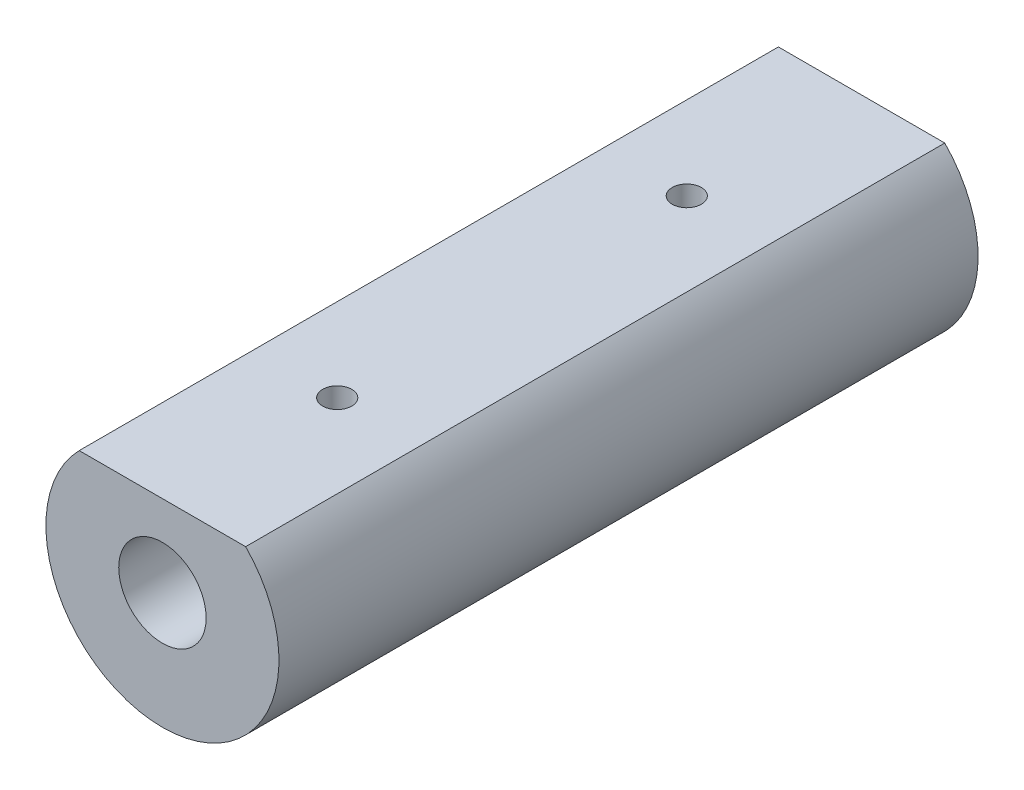
ISO-10303-21;
HEADER;
FILE_DESCRIPTION(('STEP AP214'),'2;1');
FILE_NAME('part.step','',(''),(''),'','','');
FILE_SCHEMA(('AUTOMOTIVE_DESIGN { 1 0 10303 214 1 1 1 1 }'));
ENDSEC;
DATA;
#1=APPLICATION_CONTEXT('core data for automotive mechanical design processes');
#2=APPLICATION_PROTOCOL_DEFINITION('international standard','automotive_design',2000,#1);
#3=PRODUCT_CONTEXT('',#1,'mechanical');
#4=PRODUCT('Part','Part','',(#3));
#5=PRODUCT_RELATED_PRODUCT_CATEGORY('part','',(#4));
#6=PRODUCT_DEFINITION_FORMATION('','',#4);
#7=PRODUCT_DEFINITION_CONTEXT('part definition',#1,'design');
#8=PRODUCT_DEFINITION('design','',#6,#7);
#9=PRODUCT_DEFINITION_SHAPE('','',#8);
#10=(LENGTH_UNIT() NAMED_UNIT(*) SI_UNIT(.MILLI.,.METRE.));
#11=(NAMED_UNIT(*) PLANE_ANGLE_UNIT() SI_UNIT($,.RADIAN.));
#12=(NAMED_UNIT(*) SI_UNIT($,.STERADIAN.) SOLID_ANGLE_UNIT());
#13=UNCERTAINTY_MEASURE_WITH_UNIT(LENGTH_MEASURE(1.E-05),#10,'distance_accuracy_value','');
#14=(GEOMETRIC_REPRESENTATION_CONTEXT(3) GLOBAL_UNCERTAINTY_ASSIGNED_CONTEXT((#13)) GLOBAL_UNIT_ASSIGNED_CONTEXT((#10,
#11,#12)) REPRESENTATION_CONTEXT('',''));
#15=CARTESIAN_POINT('',(0.,0.,0.));
#16=DIRECTION('',(0.,0.,1.));
#17=DIRECTION('',(1.,0.,0.));
#18=AXIS2_PLACEMENT_3D('',#15,#16,#17);
#19=CARTESIAN_POINT('',(0.,0.,60.));
#20=DIRECTION('',(0.,0.,-1.));
#21=DIRECTION('',(-1.,0.,0.));
#22=AXIS2_PLACEMENT_3D('',#19,#20,#21);
#23=CYLINDRICAL_SURFACE('',#22,10.);
#24=CARTESIAN_POINT('',(0.,0.,60.));
#25=DIRECTION('',(0.,0.,1.));
#26=DIRECTION('',(1.,0.,0.));
#27=AXIS2_PLACEMENT_3D('',#24,#25,#26);
#28=CIRCLE('',#27,10.);
#29=CARTESIAN_POINT('',(-7.14142842854285,7.,60.));
#30=VERTEX_POINT('',#29);
#31=CARTESIAN_POINT('',(7.14142842854285,7.,60.));
#32=VERTEX_POINT('',#31);
#33=EDGE_CURVE('E11',#30,#32,#28,.T.);
#34=ORIENTED_EDGE('',*,*,#33,.F.);
#35=DIRECTION('',(0.,0.,-1.));
#36=VECTOR('',#35,1.);
#37=CARTESIAN_POINT('',(-7.14142842854285,7.,60.001));
#38=LINE('',#37,#36);
#39=CARTESIAN_POINT('',(-7.14142842854285,7.,0.));
#40=VERTEX_POINT('',#39);
#41=EDGE_CURVE('E52',#30,#40,#38,.T.);
#42=ORIENTED_EDGE('',*,*,#41,.T.);
#43=CARTESIAN_POINT('',(0.,0.,0.));
#44=DIRECTION('',(0.,0.,1.));
#45=DIRECTION('',(1.,0.,0.));
#46=AXIS2_PLACEMENT_3D('',#43,#44,#45);
#47=CIRCLE('',#46,10.);
#48=CARTESIAN_POINT('',(7.14142842854285,7.,0.));
#49=VERTEX_POINT('',#48);
#50=EDGE_CURVE('E36',#40,#49,#47,.T.);
#51=ORIENTED_EDGE('',*,*,#50,.T.);
#52=DIRECTION('',(0.,0.,-1.));
#53=VECTOR('',#52,1.);
#54=CARTESIAN_POINT('',(7.14142842854285,7.,60.001));
#55=LINE('',#54,#53);
#56=EDGE_CURVE('E47',#32,#49,#55,.T.);
#57=ORIENTED_EDGE('',*,*,#56,.F.);
#58=EDGE_LOOP('',(#34,#42,#51,#57));
#59=FACE_BOUND('',#58,.T.);
#60=ADVANCED_FACE('F33',(#59),#23,.T.);
#61=CARTESIAN_POINT('',(0.,0.,60.));
#62=DIRECTION('',(0.,0.,1.));
#63=DIRECTION('',(1.,0.,0.));
#64=AXIS2_PLACEMENT_3D('',#61,#62,#63);
#65=PLANE('',#64);
#66=CARTESIAN_POINT('',(0.,0.,60.));
#67=DIRECTION('',(0.,0.,1.));
#68=DIRECTION('',(1.,0.,0.));
#69=AXIS2_PLACEMENT_3D('',#66,#67,#68);
#70=CIRCLE('',#69,3.75);
#71=CARTESIAN_POINT('',(3.75,0.,60.));
#72=VERTEX_POINT('',#71);
#73=EDGE_CURVE('E106',#72,#72,#70,.F.);
#74=ORIENTED_EDGE('',*,*,#73,.T.);
#75=EDGE_LOOP('',(#74));
#76=FACE_BOUND('',#75,.T.);
#77=DIRECTION('',(-1.,0.,0.));
#78=VECTOR('',#77,1.);
#79=CARTESIAN_POINT('',(7.14142842854285,7.,60.));
#80=LINE('',#79,#78);
#81=EDGE_CURVE('E57',#32,#30,#80,.T.);
#82=ORIENTED_EDGE('',*,*,#81,.T.);
#83=ORIENTED_EDGE('',*,*,#33,.T.);
#84=EDGE_LOOP('',(#82,#83));
#85=FACE_BOUND('',#84,.T.);
#86=ADVANCED_FACE('F67',(#76,#85),#65,.T.);
#87=CARTESIAN_POINT('',(0.,0.,0.));
#88=DIRECTION('',(0.,0.,1.));
#89=DIRECTION('',(1.,0.,0.));
#90=AXIS2_PLACEMENT_3D('',#87,#88,#89);
#91=PLANE('',#90);
#92=CARTESIAN_POINT('',(0.,0.,0.));
#93=DIRECTION('',(0.,0.,-1.));
#94=DIRECTION('',(-1.,0.,0.));
#95=AXIS2_PLACEMENT_3D('',#92,#93,#94);
#96=CIRCLE('',#95,3.75);
#97=CARTESIAN_POINT('',(-3.75,0.,0.));
#98=VERTEX_POINT('',#97);
#99=EDGE_CURVE('E107',#98,#98,#96,.T.);
#100=ORIENTED_EDGE('',*,*,#99,.F.);
#101=EDGE_LOOP('',(#100));
#102=FACE_BOUND('',#101,.T.);
#103=ORIENTED_EDGE('',*,*,#50,.F.);
#104=DIRECTION('',(-1.,0.,0.));
#105=VECTOR('',#104,1.);
#106=CARTESIAN_POINT('',(7.14142842854285,7.,0.));
#107=LINE('',#106,#105);
#108=EDGE_CURVE('E65',#49,#40,#107,.T.);
#109=ORIENTED_EDGE('',*,*,#108,.F.);
#110=EDGE_LOOP('',(#103,#109));
#111=FACE_BOUND('',#110,.T.);
#112=ADVANCED_FACE('F69',(#102,#111),#91,.F.);
#113=CARTESIAN_POINT('',(7.14142842854285,7.,60.001));
#114=DIRECTION('',(0.,-1.,0.));
#115=DIRECTION('',(0.,0.,-1.));
#116=AXIS2_PLACEMENT_3D('',#113,#114,#115);
#117=PLANE('',#116);
#118=CARTESIAN_POINT('',(0.,7.,45.));
#119=DIRECTION('',(0.,1.,0.));
#120=DIRECTION('',(0.,0.,1.));
#121=AXIS2_PLACEMENT_3D('',#118,#119,#120);
#122=CIRCLE('',#121,1.25);
#123=CARTESIAN_POINT('',(0.,7.,46.25));
#124=VERTEX_POINT('',#123);
#125=EDGE_CURVE('E102',#124,#124,#122,.T.);
#126=ORIENTED_EDGE('',*,*,#125,.F.);
#127=EDGE_LOOP('',(#126));
#128=FACE_BOUND('',#127,.T.);
#129=CARTESIAN_POINT('',(0.,7.,15.));
#130=DIRECTION('',(0.,1.,0.));
#131=DIRECTION('',(0.,0.,1.));
#132=AXIS2_PLACEMENT_3D('',#129,#130,#131);
#133=CIRCLE('',#132,1.25);
#134=CARTESIAN_POINT('',(0.,7.,16.25));
#135=VERTEX_POINT('',#134);
#136=EDGE_CURVE('E101',#135,#135,#133,.T.);
#137=ORIENTED_EDGE('',*,*,#136,.F.);
#138=EDGE_LOOP('',(#137));
#139=FACE_BOUND('',#138,.T.);
#140=ORIENTED_EDGE('',*,*,#56,.T.);
#141=ORIENTED_EDGE('',*,*,#108,.T.);
#142=ORIENTED_EDGE('',*,*,#41,.F.);
#143=ORIENTED_EDGE('',*,*,#81,.F.);
#144=EDGE_LOOP('',(#140,#141,#142,#143));
#145=FACE_BOUND('',#144,.T.);
#146=ADVANCED_FACE('F58',(#128,#139,#145),#117,.F.);
#147=CARTESIAN_POINT('',(0.,0.,60.001));
#148=DIRECTION('',(0.,0.,-1.));
#149=DIRECTION('',(-1.,0.,0.));
#150=AXIS2_PLACEMENT_3D('',#147,#148,#149);
#151=CYLINDRICAL_SURFACE('',#150,3.75);
#152=CARTESIAN_POINT('',(0.,3.75,46.25));
#153=CARTESIAN_POINT('',(-0.0682042036084021,3.7500001912618,46.2500003171645));
#154=CARTESIAN_POINT('',(-0.136406493173185,3.74812211884431,46.244399667341));
#155=CARTESIAN_POINT('',(-0.270802201091213,3.74081512754101,46.2222136139785));
#156=CARTESIAN_POINT('',(-0.33699541014852,3.7353858400269,46.2056270700638));
#157=CARTESIAN_POINT('',(-0.465415986877218,3.72156634883053,46.1621009457699));
#158=CARTESIAN_POINT('',(-0.52764978235754,3.71318109663566,46.1351786719259));
#159=CARTESIAN_POINT('',(-0.646718671006654,3.69430557146677,46.0718235339521));
#160=CARTESIAN_POINT('',(-0.703552696198381,3.68381488334722,46.0353887937468));
#161=CARTESIAN_POINT('',(-0.812177093777833,3.66142618053756,45.9527177439266));
#162=CARTESIAN_POINT('',(-0.863754625372886,3.64949445579731,45.9062109571744));
#163=CARTESIAN_POINT('',(-0.958540865877605,3.62575393478901,45.8052910566168));
#164=CARTESIAN_POINT('',(-1.00174773186183,3.61394516613186,45.7508762063394));
#165=CARTESIAN_POINT('',(-1.07978117778482,3.59141665596592,45.6337686060044));
#166=CARTESIAN_POINT('',(-1.11433107277629,3.5807379909461,45.5708828253348));
#167=CARTESIAN_POINT('',(-1.17227359234715,3.56219131773251,45.4397798819268));
#168=CARTESIAN_POINT('',(-1.19566962173346,3.55432245200932,45.3715643535466));
#169=CARTESIAN_POINT('',(-1.22984182688645,3.54264129086721,45.2341584731291));
#170=CARTESIAN_POINT('',(-1.24101681033971,3.53870119712014,45.1650784893887));
#171=CARTESIAN_POINT('',(-1.2516764041681,3.53494570786884,45.0259203073051));
#172=CARTESIAN_POINT('',(-1.2511646270059,3.53512903778412,44.9558424241135));
#173=CARTESIAN_POINT('',(-1.23877487962927,3.53948768760225,44.820079211945));
#174=CARTESIAN_POINT('',(-1.22741739145874,3.54348019834416,44.7543394963512));
#175=CARTESIAN_POINT('',(-1.19450770356177,3.55470822155688,44.6257582254915));
#176=CARTESIAN_POINT('',(-1.17295428323984,3.56194412230134,44.5629170182062));
#177=CARTESIAN_POINT('',(-1.11992382257526,3.57897388914061,44.4407340630106));
#178=CARTESIAN_POINT('',(-1.08829256088408,3.58880707241396,44.3814649681631));
#179=CARTESIAN_POINT('',(-1.01611138287892,3.60990698219658,44.2689113646503));
#180=CARTESIAN_POINT('',(-0.975558890455003,3.62117412238079,44.2156285913333));
#181=CARTESIAN_POINT('',(-0.884186665852793,3.64459161459676,44.113635502299));
#182=CARTESIAN_POINT('',(-0.832941437595387,3.65675736693553,44.0653091318637));
#183=CARTESIAN_POINT('',(-0.722924462462579,3.68008672983796,43.9778359166708));
#184=CARTESIAN_POINT('',(-0.664151994576016,3.69125024422584,43.9386899522944));
#185=CARTESIAN_POINT('',(-0.539934516307832,3.71146384922242,43.8703796247062));
#186=CARTESIAN_POINT('',(-0.474429095520419,3.72049187510049,43.8413181358241));
#187=CARTESIAN_POINT('',(-0.339086354205634,3.73525708930543,43.7947460325554));
#188=CARTESIAN_POINT('',(-0.269250547693692,3.74099542068599,43.7772314057207));
#189=CARTESIAN_POINT('',(-0.130479786911631,3.748345338393,43.754930417472));
#190=CARTESIAN_POINT('',(-0.061636999831058,3.7501250229216,43.7496252385341));
#191=CARTESIAN_POINT('',(0.0759688374502971,3.74986128368534,43.7504158419981));
#192=CARTESIAN_POINT('',(0.144731899149564,3.74781850524203,43.7565096999748));
#193=CARTESIAN_POINT('',(0.278149832880321,3.7402503089638,43.77951488467));
#194=CARTESIAN_POINT('',(0.342866008543556,3.7348274838899,43.7961077575619));
#195=CARTESIAN_POINT('',(0.46856994822447,3.72114808537587,43.8392418055834));
#196=CARTESIAN_POINT('',(0.529557235635761,3.71289115058343,43.8657842493347));
#197=CARTESIAN_POINT('',(0.647860370491593,3.69411164109112,43.928838039801));
#198=CARTESIAN_POINT('',(0.705037449021434,3.68353518444732,43.965593241604));
#199=CARTESIAN_POINT('',(0.812581037669483,3.66131567395328,44.0477426875169));
#200=CARTESIAN_POINT('',(0.862945459744472,3.64967229492284,44.0931395700397));
#201=CARTESIAN_POINT('',(0.957815634757876,3.62596059975555,44.1937234387582));
#202=CARTESIAN_POINT('',(1.00195121155721,3.61389701359285,44.2492615336586));
#203=CARTESIAN_POINT('',(1.08032190290447,3.59124966618386,44.3672144597636));
#204=CARTESIAN_POINT('',(1.11455693491377,3.58066591727503,44.4296293482926));
#205=CARTESIAN_POINT('',(1.17199616302045,3.56227989739229,44.5595912691124));
#206=CARTESIAN_POINT('',(1.19522266520628,3.55447200991223,44.6271275989609));
#207=CARTESIAN_POINT('',(1.2298683334492,3.54263540383061,44.7654733125552));
#208=CARTESIAN_POINT('',(1.24129281869243,3.53860498279549,44.8362812067554));
#209=CARTESIAN_POINT('',(1.25159535309668,3.53497323592721,44.9752463700511));
#210=CARTESIAN_POINT('',(1.2510878216355,3.53515500321768,45.0433529253585));
#211=CARTESIAN_POINT('',(1.23905286681087,3.53939087279834,45.1784563436526));
#212=CARTESIAN_POINT('',(1.22752609932324,3.54344474461702,45.2454532724439));
#213=CARTESIAN_POINT('',(1.19421476641168,3.55480655381114,45.3751695787531));
#214=CARTESIAN_POINT('',(1.1726291825194,3.56205122528096,45.4379460312556));
#215=CARTESIAN_POINT('',(1.11997420719969,3.57895498523085,45.5590342586728));
#216=CARTESIAN_POINT('',(1.08890271069226,3.58861460954241,45.617345038985));
#217=CARTESIAN_POINT('',(1.01657586572929,3.60978536532557,45.7306045874036));
#218=CARTESIAN_POINT('',(0.974935303455729,3.62135889552671,45.785295627373));
#219=CARTESIAN_POINT('',(0.883303603919565,3.64479195354066,45.8871122667302));
#220=CARTESIAN_POINT('',(0.833310105564356,3.65665156140465,45.9342357196101));
#221=CARTESIAN_POINT('',(0.724051946150865,3.6798753815693,46.0214305153615));
#222=CARTESIAN_POINT('',(0.664501891874666,3.6912022725157,46.0611554346888));
#223=CARTESIAN_POINT('',(0.539196696758285,3.71157488965765,46.1299880360633));
#224=CARTESIAN_POINT('',(0.473443147665438,3.72062119884912,46.1590984324026));
#225=CARTESIAN_POINT('',(0.34061705900122,3.73506893835677,46.2046520406108));
#226=CARTESIAN_POINT('',(0.273734697095512,3.74061515528153,46.2216030828292));
#227=CARTESIAN_POINT('',(0.13790052001281,3.74808008830277,46.2442753508464));
#228=CARTESIAN_POINT('',(0.0689492819609346,3.74999980664881,46.2499996793707));
#229=CARTESIAN_POINT('',(0.,3.75,46.25));
#230=B_SPLINE_CURVE_WITH_KNOTS('',3,(#152,#153,#154,#155,#156,#157,#158,#159,#160,#161,#162,
#163,#164,#165,#166,#167,#168,#169,#170,#171,#172,#173,#174,#175,#176,#177,#178,#179,#180,#181,
#182,#183,#184,#185,#186,#187,#188,#189,#190,#191,#192,#193,#194,#195,#196,#197,#198,#199,#200,
#201,#202,#203,#204,#205,#206,#207,#208,#209,#210,#211,#212,#213,#214,#215,#216,#217,#218,#219,
#220,#221,#222,#223,#224,#225,#226,#227,#228,#229),.UNSPECIFIED.,.T.,.F.,(4,2,2,2,2,2,2,2,2,2,2,
2,2,2,2,2,2,2,2,2,2,2,2,2,2,2,2,2,2,2,2,2,2,2,2,2,2,2,4),(0.,0.204358882532513,
0.408738981584402,0.612778341087842,0.816857972248874,1.02730855353446,1.23780541609413,
1.45435481029338,1.67083805866042,1.880024071773,2.08914542484356,2.288710331891,
2.48829913569353,2.69110213943913,2.89396378197759,3.10741632264209,3.32088932458273,
3.53648007062947,3.7519958609651,3.95816978968962,4.16430891455221,4.36447697472767,
4.5646705660513,4.77012999804671,4.97565226027364,5.1905127860094,5.40537510293745,
5.61980017283462,5.834128558823,6.03744582580323,6.24075099189219,6.44019483850522,
6.63968297719972,6.84787583364756,7.05612763904723,7.27249576043876,7.48880851440571,
7.69545697967268,7.90204832547675),.UNSPECIFIED.);
#231=CARTESIAN_POINT('',(0.,3.75,46.25));
#232=VERTEX_POINT('',#231);
#233=EDGE_CURVE('E123',#232,#232,#230,.T.);
#234=ORIENTED_EDGE('',*,*,#233,.F.);
#235=EDGE_LOOP('',(#234));
#236=FACE_BOUND('',#235,.T.);
#237=CARTESIAN_POINT('',(0.,3.75,16.25));
#238=CARTESIAN_POINT('',(-0.0682042036084022,3.7500001912618,16.2500003171646));
#239=CARTESIAN_POINT('',(-0.136406493173186,3.74812211884431,16.244399667341));
#240=CARTESIAN_POINT('',(-0.270802201091213,3.74081512754101,16.2222136139785));
#241=CARTESIAN_POINT('',(-0.33699541014852,3.7353858400269,16.2056270700638));
#242=CARTESIAN_POINT('',(-0.465415986877219,3.72156634883053,16.1621009457699));
#243=CARTESIAN_POINT('',(-0.527649782357542,3.71318109663566,16.1351786719259));
#244=CARTESIAN_POINT('',(-0.646718671006655,3.69430557146677,16.0718235339521));
#245=CARTESIAN_POINT('',(-0.703552696198381,3.68381488334722,16.0353887937467));
#246=CARTESIAN_POINT('',(-0.812177093777831,3.66142618053756,15.9527177439266));
#247=CARTESIAN_POINT('',(-0.863754625372885,3.64949445579731,15.9062109571744));
#248=CARTESIAN_POINT('',(-0.958540865877604,3.62575393478901,15.8052910566168));
#249=CARTESIAN_POINT('',(-1.00174773186183,3.61394516613186,15.7508762063394));
#250=CARTESIAN_POINT('',(-1.07978117778482,3.59141665596592,15.6337686060044));
#251=CARTESIAN_POINT('',(-1.11433107277629,3.5807379909461,15.5708828253348));
#252=CARTESIAN_POINT('',(-1.17227359234715,3.56219131773251,15.4397798819268));
#253=CARTESIAN_POINT('',(-1.19566962173345,3.55432245200932,15.3715643535466));
#254=CARTESIAN_POINT('',(-1.22984182688645,3.54264129086721,15.2341584731291));
#255=CARTESIAN_POINT('',(-1.24101681033971,3.53870119712014,15.1650784893887));
#256=CARTESIAN_POINT('',(-1.25167640416809,3.53494570786884,15.0259203073051));
#257=CARTESIAN_POINT('',(-1.2511646270059,3.53512903778412,14.9558424241135));
#258=CARTESIAN_POINT('',(-1.23877487962927,3.53948768760225,14.820079211945));
#259=CARTESIAN_POINT('',(-1.22741739145874,3.54348019834416,14.7543394963512));
#260=CARTESIAN_POINT('',(-1.19450770356177,3.55470822155688,14.6257582254915));
#261=CARTESIAN_POINT('',(-1.17295428323984,3.56194412230134,14.5629170182062));
#262=CARTESIAN_POINT('',(-1.11992382257526,3.57897388914061,14.4407340630106));
#263=CARTESIAN_POINT('',(-1.08829256088408,3.58880707241396,14.3814649681631));
#264=CARTESIAN_POINT('',(-1.01611138287892,3.60990698219658,14.2689113646503));
#265=CARTESIAN_POINT('',(-0.975558890455004,3.62117412238079,14.2156285913333));
#266=CARTESIAN_POINT('',(-0.884186665852793,3.64459161459676,14.113635502299));
#267=CARTESIAN_POINT('',(-0.832941437595386,3.65675736693553,14.0653091318637));
#268=CARTESIAN_POINT('',(-0.722924462462577,3.68008672983796,13.9778359166708));
#269=CARTESIAN_POINT('',(-0.664151994576016,3.69125024422584,13.9386899522944));
#270=CARTESIAN_POINT('',(-0.539934516307833,3.71146384922242,13.8703796247062));
#271=CARTESIAN_POINT('',(-0.474429095520419,3.72049187510049,13.8413181358241));
#272=CARTESIAN_POINT('',(-0.339086354205632,3.73525708930543,13.7947460325554));
#273=CARTESIAN_POINT('',(-0.26925054769369,3.74099542068599,13.7772314057207));
#274=CARTESIAN_POINT('',(-0.130479786911628,3.748345338393,13.754930417472));
#275=CARTESIAN_POINT('',(-0.061636999831056,3.7501250229216,13.7496252385341));
#276=CARTESIAN_POINT('',(0.0759688374502985,3.74986128368534,13.7504158419981));
#277=CARTESIAN_POINT('',(0.144731899149565,3.74781850524203,13.7565096999748));
#278=CARTESIAN_POINT('',(0.278149832880322,3.7402503089638,13.7795148846699));
#279=CARTESIAN_POINT('',(0.342866008543556,3.7348274838899,13.7961077575619));
#280=CARTESIAN_POINT('',(0.468569948224469,3.72114808537587,13.8392418055834));
#281=CARTESIAN_POINT('',(0.52955723563576,3.71289115058343,13.8657842493347));
#282=CARTESIAN_POINT('',(0.647860370491594,3.69411164109112,13.928838039801));
#283=CARTESIAN_POINT('',(0.705037449021436,3.68353518444732,13.965593241604));
#284=CARTESIAN_POINT('',(0.812581037669485,3.66131567395328,14.0477426875169));
#285=CARTESIAN_POINT('',(0.862945459744473,3.64967229492284,14.0931395700397));
#286=CARTESIAN_POINT('',(0.957815634757877,3.62596059975555,14.1937234387582));
#287=CARTESIAN_POINT('',(1.00195121155722,3.61389701359284,14.2492615336586));
#288=CARTESIAN_POINT('',(1.08032190290447,3.59124966618385,14.3672144597636));
#289=CARTESIAN_POINT('',(1.11455693491377,3.58066591727502,14.4296293482926));
#290=CARTESIAN_POINT('',(1.17199616302045,3.56227989739229,14.5595912691124));
#291=CARTESIAN_POINT('',(1.19522266520628,3.55447200991223,14.627127598961));
#292=CARTESIAN_POINT('',(1.2298683334492,3.54263540383061,14.7654733125552));
#293=CARTESIAN_POINT('',(1.24129281869243,3.53860498279549,14.8362812067554));
#294=CARTESIAN_POINT('',(1.25159535309668,3.53497323592721,14.9752463700511));
#295=CARTESIAN_POINT('',(1.2510878216355,3.53515500321768,15.0433529253585));
#296=CARTESIAN_POINT('',(1.23905286681087,3.53939087279834,15.1784563436526));
#297=CARTESIAN_POINT('',(1.22752609932323,3.54344474461702,15.2454532724439));
#298=CARTESIAN_POINT('',(1.19421476641168,3.55480655381114,15.3751695787531));
#299=CARTESIAN_POINT('',(1.1726291825194,3.56205122528096,15.4379460312556));
#300=CARTESIAN_POINT('',(1.11997420719969,3.57895498523085,15.5590342586728));
#301=CARTESIAN_POINT('',(1.08890271069226,3.58861460954241,15.617345038985));
#302=CARTESIAN_POINT('',(1.01657586572929,3.60978536532557,15.7306045874036));
#303=CARTESIAN_POINT('',(0.974935303455729,3.62135889552671,15.785295627373));
#304=CARTESIAN_POINT('',(0.883303603919564,3.64479195354066,15.8871122667302));
#305=CARTESIAN_POINT('',(0.833310105564356,3.65665156140465,15.9342357196101));
#306=CARTESIAN_POINT('',(0.724051946150864,3.6798753815693,16.0214305153615));
#307=CARTESIAN_POINT('',(0.664501891874664,3.6912022725157,16.0611554346887));
#308=CARTESIAN_POINT('',(0.539196696758284,3.71157488965765,16.1299880360633));
#309=CARTESIAN_POINT('',(0.473443147665439,3.72062119884912,16.1590984324026));
#310=CARTESIAN_POINT('',(0.340617059001222,3.73506893835677,16.2046520406108));
#311=CARTESIAN_POINT('',(0.273734697095513,3.74061515528153,16.2216030828292));
#312=CARTESIAN_POINT('',(0.137900520012811,3.74808008830277,16.2442753508464));
#313=CARTESIAN_POINT('',(0.0689492819609349,3.74999980664881,16.2499996793707));
#314=CARTESIAN_POINT('',(0.,3.75,16.25));
#315=B_SPLINE_CURVE_WITH_KNOTS('',3,(#237,#238,#239,#240,#241,#242,#243,#244,#245,#246,#247,
#248,#249,#250,#251,#252,#253,#254,#255,#256,#257,#258,#259,#260,#261,#262,#263,#264,#265,#266,
#267,#268,#269,#270,#271,#272,#273,#274,#275,#276,#277,#278,#279,#280,#281,#282,#283,#284,#285,
#286,#287,#288,#289,#290,#291,#292,#293,#294,#295,#296,#297,#298,#299,#300,#301,#302,#303,#304,
#305,#306,#307,#308,#309,#310,#311,#312,#313,#314),.UNSPECIFIED.,.T.,.F.,(4,2,2,2,2,2,2,2,2,2,2,
2,2,2,2,2,2,2,2,2,2,2,2,2,2,2,2,2,2,2,2,2,2,2,2,2,2,2,4),(0.,0.204358882532514,
0.408738981584401,0.612778341087844,0.816857972248875,1.02730855353445,1.23780541609413,
1.45435481029338,1.67083805866041,1.880024071773,2.08914542484357,2.288710331891,
2.48829913569352,2.69110213943913,2.89396378197759,3.10741632264209,3.32088932458273,
3.53648007062947,3.7519958609651,3.95816978968962,4.16430891455221,4.36447697472767,
4.5646705660513,4.77012999804671,4.97565226027364,5.1905127860094,5.40537510293746,
5.61980017283463,5.834128558823,6.03744582580323,6.24075099189219,6.44019483850522,
6.63968297719972,6.84787583364756,7.05612763904723,7.27249576043875,7.4888085144057,
7.69545697967267,7.90204832547675),.UNSPECIFIED.);
#316=CARTESIAN_POINT('',(0.,3.75,16.25));
#317=VERTEX_POINT('',#316);
#318=EDGE_CURVE('E95',#317,#317,#315,.T.);
#319=ORIENTED_EDGE('',*,*,#318,.F.);
#320=EDGE_LOOP('',(#319));
#321=FACE_BOUND('',#320,.T.);
#322=ORIENTED_EDGE('',*,*,#73,.F.);
#323=EDGE_LOOP('',(#322));
#324=FACE_BOUND('',#323,.T.);
#325=ORIENTED_EDGE('',*,*,#99,.T.);
#326=EDGE_LOOP('',(#325));
#327=FACE_BOUND('',#326,.T.);
#328=ADVANCED_FACE('F81',(#236,#321,#324,#327),#151,.F.);
#329=CARTESIAN_POINT('',(0.,-10.001,15.));
#330=DIRECTION('',(0.,1.,0.));
#331=DIRECTION('',(0.,0.,1.));
#332=AXIS2_PLACEMENT_3D('',#329,#330,#331);
#333=CYLINDRICAL_SURFACE('',#332,1.25);
#334=ORIENTED_EDGE('',*,*,#136,.T.);
#335=EDGE_LOOP('',(#334));
#336=FACE_BOUND('',#335,.T.);
#337=ORIENTED_EDGE('',*,*,#318,.T.);
#338=EDGE_LOOP('',(#337));
#339=FACE_BOUND('',#338,.T.);
#340=ADVANCED_FACE('F85',(#336,#339),#333,.F.);
#341=CARTESIAN_POINT('',(0.,-10.001,45.));
#342=DIRECTION('',(0.,1.,0.));
#343=DIRECTION('',(0.,0.,1.));
#344=AXIS2_PLACEMENT_3D('',#341,#342,#343);
#345=CYLINDRICAL_SURFACE('',#344,1.25);
#346=ORIENTED_EDGE('',*,*,#125,.T.);
#347=EDGE_LOOP('',(#346));
#348=FACE_BOUND('',#347,.T.);
#349=ORIENTED_EDGE('',*,*,#233,.T.);
#350=EDGE_LOOP('',(#349));
#351=FACE_BOUND('',#350,.T.);
#352=ADVANCED_FACE('F90',(#348,#351),#345,.F.);
#353=CLOSED_SHELL('',(#60,#86,#112,#146,#328,#340,#352));
#354=MANIFOLD_SOLID_BREP('B2',#353);
#355=ADVANCED_BREP_SHAPE_REPRESENTATION('',(#18,#354),#14);
#356=SHAPE_DEFINITION_REPRESENTATION(#9,#355);
ENDSEC;
END-ISO-10303-21;
